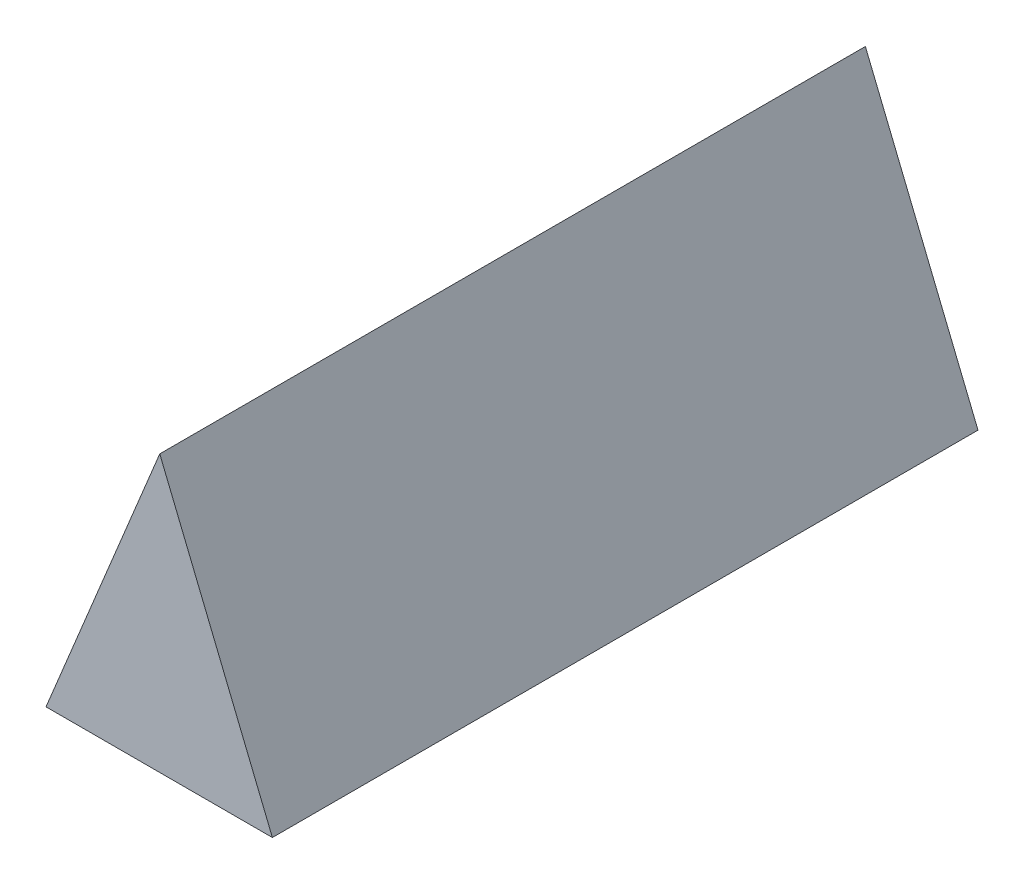
ISO-10303-21;
HEADER;
FILE_DESCRIPTION(('STEP AP214'),'2;1');
FILE_NAME('part.step','',(''),(''),'','','');
FILE_SCHEMA(('AUTOMOTIVE_DESIGN { 1 0 10303 214 1 1 1 1 }'));
ENDSEC;
DATA;
#1=APPLICATION_CONTEXT('core data for automotive mechanical design processes');
#2=APPLICATION_PROTOCOL_DEFINITION('international standard','automotive_design',2000,#1);
#3=PRODUCT_CONTEXT('',#1,'mechanical');
#4=PRODUCT('Part','Part','',(#3));
#5=PRODUCT_RELATED_PRODUCT_CATEGORY('part','',(#4));
#6=PRODUCT_DEFINITION_FORMATION('','',#4);
#7=PRODUCT_DEFINITION_CONTEXT('part definition',#1,'design');
#8=PRODUCT_DEFINITION('design','',#6,#7);
#9=PRODUCT_DEFINITION_SHAPE('','',#8);
#10=(LENGTH_UNIT() NAMED_UNIT(*) SI_UNIT(.MILLI.,.METRE.));
#11=(NAMED_UNIT(*) PLANE_ANGLE_UNIT() SI_UNIT($,.RADIAN.));
#12=(NAMED_UNIT(*) SI_UNIT($,.STERADIAN.) SOLID_ANGLE_UNIT());
#13=UNCERTAINTY_MEASURE_WITH_UNIT(LENGTH_MEASURE(1.E-05),#10,'distance_accuracy_value','');
#14=(GEOMETRIC_REPRESENTATION_CONTEXT(3) GLOBAL_UNCERTAINTY_ASSIGNED_CONTEXT((#13)) GLOBAL_UNIT_ASSIGNED_CONTEXT((#10,
#11,#12)) REPRESENTATION_CONTEXT('',''));
#15=CARTESIAN_POINT('',(0.,0.,0.));
#16=DIRECTION('',(0.,0.,1.));
#17=DIRECTION('',(1.,0.,0.));
#18=AXIS2_PLACEMENT_3D('',#15,#16,#17);
#19=CARTESIAN_POINT('',(6.010806626906,1.229155698179,0.));
#20=DIRECTION('',(-0.924533464310556,0.381100870334774,0.));
#21=DIRECTION('',(-0.381100870334774,-0.924533464310556,0.));
#22=AXIS2_PLACEMENT_3D('',#19,#20,#21);
#23=PLANE('',#22);
#24=DIRECTION('',(-0.381100870334774,-0.924533464310556,0.));
#25=VECTOR('',#24,1.);
#26=CARTESIAN_POINT('',(6.010806626906,1.229155698179,0.));
#27=LINE('',#26,#25);
#28=CARTESIAN_POINT('',(6.010806626906,1.229155698179,0.));
#29=VERTEX_POINT('',#28);
#30=CARTESIAN_POINT('',(5.994685026906,1.190045426179,0.));
#31=VERTEX_POINT('',#30);
#32=EDGE_CURVE('E11',#29,#31,#27,.T.);
#33=ORIENTED_EDGE('',*,*,#32,.T.);
#34=DIRECTION('',(0.,0.,1.));
#35=VECTOR('',#34,1.);
#36=CARTESIAN_POINT('',(5.994685026906,1.190045426179,0.));
#37=LINE('',#36,#35);
#38=CARTESIAN_POINT('',(5.994685026906,1.190045426179,0.1));
#39=VERTEX_POINT('',#38);
#40=EDGE_CURVE('E24',#31,#39,#37,.T.);
#41=ORIENTED_EDGE('',*,*,#40,.T.);
#42=DIRECTION('',(-0.381100870334774,-0.924533464310556,0.));
#43=VECTOR('',#42,1.);
#44=CARTESIAN_POINT('',(6.010806626906,1.229155698179,0.1));
#45=LINE('',#44,#43);
#46=CARTESIAN_POINT('',(6.010806626906,1.229155698179,0.1));
#47=VERTEX_POINT('',#46);
#48=EDGE_CURVE('E67',#47,#39,#45,.T.);
#49=ORIENTED_EDGE('',*,*,#48,.F.);
#50=DIRECTION('',(0.,0.,1.));
#51=VECTOR('',#50,1.);
#52=CARTESIAN_POINT('',(6.010806626906,1.229155698179,0.));
#53=LINE('',#52,#51);
#54=EDGE_CURVE('E54',#29,#47,#53,.T.);
#55=ORIENTED_EDGE('',*,*,#54,.F.);
#56=EDGE_LOOP('',(#33,#41,#49,#55));
#57=FACE_BOUND('',#56,.T.);
#58=ADVANCED_FACE('F17',(#57),#23,.T.);
#59=CARTESIAN_POINT('',(6.026768226906,1.190045426179,0.));
#60=DIRECTION('',(0.925862355658946,0.377860951109886,0.));
#61=DIRECTION('',(-0.377860951109886,0.925862355658946,0.));
#62=AXIS2_PLACEMENT_3D('',#59,#60,#61);
#63=PLANE('',#62);
#64=DIRECTION('',(-0.377860951109886,0.925862355658946,0.));
#65=VECTOR('',#64,1.);
#66=CARTESIAN_POINT('',(6.026768226906,1.190045426179,0.));
#67=LINE('',#66,#65);
#68=CARTESIAN_POINT('',(6.026768226906,1.190045426179,0.));
#69=VERTEX_POINT('',#68);
#70=EDGE_CURVE('E58',#69,#29,#67,.T.);
#71=ORIENTED_EDGE('',*,*,#70,.T.);
#72=ORIENTED_EDGE('',*,*,#54,.T.);
#73=DIRECTION('',(-0.377860951109886,0.925862355658946,0.));
#74=VECTOR('',#73,1.);
#75=CARTESIAN_POINT('',(6.026768226906,1.190045426179,0.1));
#76=LINE('',#75,#74);
#77=CARTESIAN_POINT('',(6.026768226906,1.190045426179,0.1));
#78=VERTEX_POINT('',#77);
#79=EDGE_CURVE('E48',#78,#47,#76,.T.);
#80=ORIENTED_EDGE('',*,*,#79,.F.);
#81=DIRECTION('',(0.,0.,1.));
#82=VECTOR('',#81,1.);
#83=CARTESIAN_POINT('',(6.026768226906,1.190045426179,0.));
#84=LINE('',#83,#82);
#85=EDGE_CURVE('E52',#69,#78,#84,.T.);
#86=ORIENTED_EDGE('',*,*,#85,.F.);
#87=EDGE_LOOP('',(#71,#72,#80,#86));
#88=FACE_BOUND('',#87,.T.);
#89=ADVANCED_FACE('F51',(#88),#63,.T.);
#90=CARTESIAN_POINT('',(5.994685026906,1.190045426179,0.));
#91=DIRECTION('',(0.,-1.,0.));
#92=DIRECTION('',(1.,0.,0.));
#93=AXIS2_PLACEMENT_3D('',#90,#91,#92);
#94=PLANE('',#93);
#95=DIRECTION('',(1.,0.,0.));
#96=VECTOR('',#95,1.);
#97=CARTESIAN_POINT('',(5.994685026906,1.190045426179,0.));
#98=LINE('',#97,#96);
#99=EDGE_CURVE('E64',#31,#69,#98,.T.);
#100=ORIENTED_EDGE('',*,*,#99,.T.);
#101=ORIENTED_EDGE('',*,*,#85,.T.);
#102=DIRECTION('',(1.,0.,0.));
#103=VECTOR('',#102,1.);
#104=CARTESIAN_POINT('',(5.994685026906,1.190045426179,0.1));
#105=LINE('',#104,#103);
#106=EDGE_CURVE('E63',#39,#78,#105,.T.);
#107=ORIENTED_EDGE('',*,*,#106,.F.);
#108=ORIENTED_EDGE('',*,*,#40,.F.);
#109=EDGE_LOOP('',(#100,#101,#107,#108));
#110=FACE_BOUND('',#109,.T.);
#111=ADVANCED_FACE('F62',(#110),#94,.T.);
#112=CARTESIAN_POINT('',(6.010751447623,1.20422113485,0.1));
#113=DIRECTION('',(0.,0.,1.));
#114=DIRECTION('',(1.,0.,0.));
#115=AXIS2_PLACEMENT_3D('',#112,#113,#114);
#116=PLANE('',#115);
#117=ORIENTED_EDGE('',*,*,#106,.T.);
#118=ORIENTED_EDGE('',*,*,#79,.T.);
#119=ORIENTED_EDGE('',*,*,#48,.T.);
#120=EDGE_LOOP('',(#117,#118,#119));
#121=FACE_BOUND('',#120,.T.);
#122=ADVANCED_FACE('F66',(#121),#116,.T.);
#123=CARTESIAN_POINT('',(6.010751447623,1.20422113485,0.));
#124=DIRECTION('',(0.,0.,1.));
#125=DIRECTION('',(1.,0.,0.));
#126=AXIS2_PLACEMENT_3D('',#123,#124,#125);
#127=PLANE('',#126);
#128=ORIENTED_EDGE('',*,*,#99,.F.);
#129=ORIENTED_EDGE('',*,*,#32,.F.);
#130=ORIENTED_EDGE('',*,*,#70,.F.);
#131=EDGE_LOOP('',(#128,#129,#130));
#132=FACE_BOUND('',#131,.T.);
#133=ADVANCED_FACE('F73',(#132),#127,.F.);
#134=CLOSED_SHELL('',(#58,#89,#111,#122,#133));
#135=MANIFOLD_SOLID_BREP('B1',#134);
#136=ADVANCED_BREP_SHAPE_REPRESENTATION('',(#18,#135),#14);
#137=SHAPE_DEFINITION_REPRESENTATION(#9,#136);
ENDSEC;
END-ISO-10303-21;
